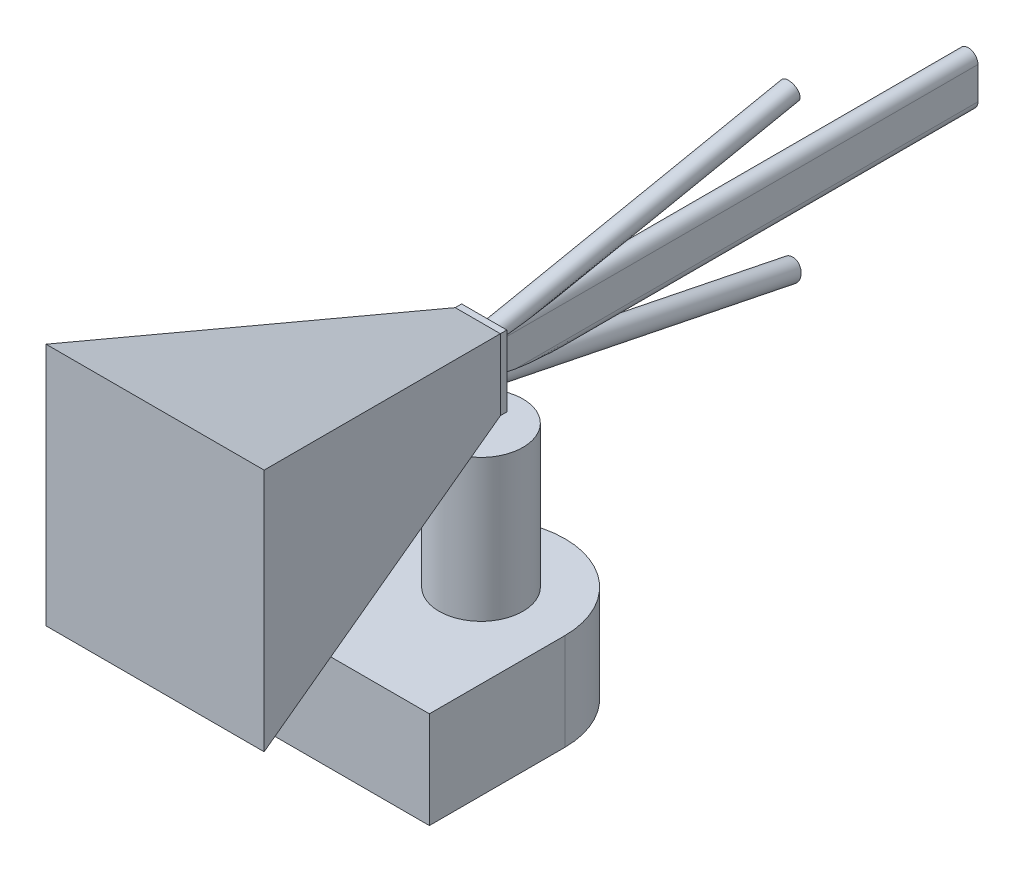
ISO-10303-21;
HEADER;
FILE_DESCRIPTION(('STEP AP214'),'2;1');
FILE_NAME('part.step','',(''),(''),'','','');
FILE_SCHEMA(('AUTOMOTIVE_DESIGN { 1 0 10303 214 1 1 1 1 }'));
ENDSEC;
DATA;
#1=APPLICATION_CONTEXT('core data for automotive mechanical design processes');
#2=APPLICATION_PROTOCOL_DEFINITION('international standard','automotive_design',2000,#1);
#3=PRODUCT_CONTEXT('',#1,'mechanical');
#4=PRODUCT('Part','Part','',(#3));
#5=PRODUCT_RELATED_PRODUCT_CATEGORY('part','',(#4));
#6=PRODUCT_DEFINITION_FORMATION('','',#4);
#7=PRODUCT_DEFINITION_CONTEXT('part definition',#1,'design');
#8=PRODUCT_DEFINITION('design','',#6,#7);
#9=PRODUCT_DEFINITION_SHAPE('','',#8);
#10=(LENGTH_UNIT() NAMED_UNIT(*) SI_UNIT(.MILLI.,.METRE.));
#11=(NAMED_UNIT(*) PLANE_ANGLE_UNIT() SI_UNIT($,.RADIAN.));
#12=(NAMED_UNIT(*) SI_UNIT($,.STERADIAN.) SOLID_ANGLE_UNIT());
#13=UNCERTAINTY_MEASURE_WITH_UNIT(LENGTH_MEASURE(1.E-05),#10,'distance_accuracy_value','');
#14=(GEOMETRIC_REPRESENTATION_CONTEXT(3) GLOBAL_UNCERTAINTY_ASSIGNED_CONTEXT((#13)) GLOBAL_UNIT_ASSIGNED_CONTEXT((#10,
#11,#12)) REPRESENTATION_CONTEXT('',''));
#15=CARTESIAN_POINT('',(0.,0.,0.));
#16=DIRECTION('',(0.,0.,1.));
#17=DIRECTION('',(1.,0.,0.));
#18=AXIS2_PLACEMENT_3D('',#15,#16,#17);
#19=CARTESIAN_POINT('',(0.,40.,0.));
#20=DIRECTION('',(0.,-1.,0.));
#21=DIRECTION('',(0.,0.,-1.));
#22=AXIS2_PLACEMENT_3D('',#19,#20,#21);
#23=CYLINDRICAL_SURFACE('',#22,1.);
#24=CARTESIAN_POINT('',(0.,37.,0.));
#25=DIRECTION('',(0.,1.,0.));
#26=DIRECTION('',(0.,0.,1.));
#27=AXIS2_PLACEMENT_3D('',#24,#25,#26);
#28=CIRCLE('',#27,1.);
#29=CARTESIAN_POINT('',(0.,37.,1.));
#30=VERTEX_POINT('',#29);
#31=EDGE_CURVE('E220',#30,#30,#28,.T.);
#32=ORIENTED_EDGE('',*,*,#31,.T.);
#33=EDGE_LOOP('',(#32));
#34=FACE_BOUND('',#33,.T.);
#35=CARTESIAN_POINT('',(0.,40.1339745962156,0.));
#36=DIRECTION('',(0.,-0.965925826289068,-0.258819045102521));
#37=DIRECTION('',(0.,-0.258819045102521,0.965925826289068));
#38=AXIS2_PLACEMENT_3D('',#35,#36,#37);
#39=ELLIPSE('',#38,1.03527618041008,1.);
#40=CARTESIAN_POINT('',(-0.866025403784437,40.,0.5));
#41=VERTEX_POINT('',#40);
#42=CARTESIAN_POINT('',(0.866025403784439,40.,0.5));
#43=VERTEX_POINT('',#42);
#44=EDGE_CURVE('E306',#41,#43,#39,.F.);
#45=ORIENTED_EDGE('',*,*,#44,.F.);
#46=CARTESIAN_POINT('',(0.,40.,0.));
#47=DIRECTION('',(0.,1.,0.));
#48=DIRECTION('',(0.,0.,1.));
#49=AXIS2_PLACEMENT_3D('',#46,#47,#48);
#50=CIRCLE('',#49,1.);
#51=CARTESIAN_POINT('',(-0.866025403784439,40.,-0.5));
#52=VERTEX_POINT('',#51);
#53=EDGE_CURVE('E214',#52,#41,#50,.T.);
#54=ORIENTED_EDGE('',*,*,#53,.F.);
#55=CARTESIAN_POINT('',(0.866025403784439,40.,-0.5));
#56=VERTEX_POINT('',#55);
#57=EDGE_CURVE('E219',#56,#52,#50,.T.);
#58=ORIENTED_EDGE('',*,*,#57,.F.);
#59=EDGE_CURVE('E215',#43,#56,#50,.T.);
#60=ORIENTED_EDGE('',*,*,#59,.F.);
#61=EDGE_LOOP('',(#45,#54,#58,#60));
#62=FACE_BOUND('',#61,.T.);
#63=ADVANCED_FACE('F43',(#34,#62),#23,.T.);
#64=CARTESIAN_POINT('',(0.,48.1244609673791,-75.5));
#65=DIRECTION('',(0.,0.,1.));
#66=DIRECTION('',(1.,0.,0.));
#67=AXIS2_PLACEMENT_3D('',#64,#65,#66);
#68=CYLINDRICAL_SURFACE('',#67,1.5);
#69=CARTESIAN_POINT('',(0.,48.1244609673791,-0.69537024483542));
#70=DIRECTION('',(0.,-0.10018806161207,0.994968518250912));
#71=DIRECTION('',(0.,0.994968518250913,0.100188061612069));
#72=AXIS2_PLACEMENT_3D('',#69,#70,#71);
#73=ELLIPSE('',#72,1.50758538836676,1.5);
#74=CARTESIAN_POINT('',(-1.5,48.1244609673791,-0.69537024483542));
#75=VERTEX_POINT('',#74);
#76=CARTESIAN_POINT('',(1.5,48.1244609673791,-0.695370244835212));
#77=VERTEX_POINT('',#76);
#78=EDGE_CURVE('E11',#75,#77,#73,.F.);
#79=ORIENTED_EDGE('',*,*,#78,.F.);
#80=DIRECTION('',(0.,0.,1.));
#81=VECTOR('',#80,1.);
#82=CARTESIAN_POINT('',(-1.5,48.1244609673791,-75.5));
#83=LINE('',#82,#81);
#84=CARTESIAN_POINT('',(-1.5,48.1244609673791,-0.5));
#85=VERTEX_POINT('',#84);
#86=EDGE_CURVE('E269',#75,#85,#83,.T.);
#87=ORIENTED_EDGE('',*,*,#86,.T.);
#88=CARTESIAN_POINT('',(0.,48.1244609673791,-0.5));
#89=DIRECTION('',(0.,0.,-1.));
#90=DIRECTION('',(-1.,0.,0.));
#91=AXIS2_PLACEMENT_3D('',#88,#89,#90);
#92=CIRCLE('',#91,1.5);
#93=CARTESIAN_POINT('',(1.5,48.1244609673791,-0.5));
#94=VERTEX_POINT('',#93);
#95=EDGE_CURVE('E273',#85,#94,#92,.T.);
#96=ORIENTED_EDGE('',*,*,#95,.T.);
#97=DIRECTION('',(0.,0.,1.));
#98=VECTOR('',#97,1.);
#99=CARTESIAN_POINT('',(1.5,48.1244609673791,-75.5));
#100=LINE('',#99,#98);
#101=EDGE_CURVE('E271',#77,#94,#100,.T.);
#102=ORIENTED_EDGE('',*,*,#101,.F.);
#103=EDGE_LOOP('',(#79,#87,#96,#102));
#104=FACE_BOUND('',#103,.T.);
#105=ADVANCED_FACE('F266',(#104),#68,.T.);
#106=CARTESIAN_POINT('',(0.,48.1244609673791,-0.69537024483542));
#107=DIRECTION('',(0.,0.994968518250913,0.100188061612069));
#108=DIRECTION('',(0.,-0.10018806161207,0.994968518250912));
#109=AXIS2_PLACEMENT_3D('',#106,#107,#108);
#110=ELLIPSE('',#109,14.9718437093637,1.5);
#111=EDGE_CURVE('E51',#77,#75,#110,.T.);
#112=ORIENTED_EDGE('',*,*,#111,.F.);
#113=CARTESIAN_POINT('',(1.5,48.1244609673791,-75.5));
#114=VERTEX_POINT('',#113);
#115=EDGE_CURVE('E274',#114,#77,#100,.T.);
#116=ORIENTED_EDGE('',*,*,#115,.F.);
#117=CARTESIAN_POINT('',(0.,48.1244609673791,-75.5));
#118=DIRECTION('',(0.,0.,-1.));
#119=DIRECTION('',(-1.,0.,0.));
#120=AXIS2_PLACEMENT_3D('',#117,#118,#119);
#121=CIRCLE('',#120,1.5);
#122=CARTESIAN_POINT('',(-1.5,48.1244609673791,-75.5));
#123=VERTEX_POINT('',#122);
#124=EDGE_CURVE('E656',#123,#114,#121,.T.);
#125=ORIENTED_EDGE('',*,*,#124,.F.);
#126=EDGE_CURVE('E666',#123,#75,#83,.T.);
#127=ORIENTED_EDGE('',*,*,#126,.T.);
#128=EDGE_LOOP('',(#112,#116,#125,#127));
#129=FACE_BOUND('',#128,.T.);
#130=ADVANCED_FACE('F389',(#129),#68,.T.);
#131=CARTESIAN_POINT('',(1.5,48.1244609673791,-75.5));
#132=DIRECTION('',(-1.,0.,0.));
#133=DIRECTION('',(0.,-1.,0.));
#134=AXIS2_PLACEMENT_3D('',#131,#132,#133);
#135=PLANE('',#134);
#136=DIRECTION('',(0.,-1.,0.));
#137=VECTOR('',#136,1.);
#138=CARTESIAN_POINT('',(1.5,48.1244609673791,-0.5));
#139=LINE('',#138,#137);
#140=CARTESIAN_POINT('',(1.5,43.7827208852217,-0.500000000000004));
#141=VERTEX_POINT('',#140);
#142=EDGE_CURVE('E65',#94,#141,#139,.T.);
#143=ORIENTED_EDGE('',*,*,#142,.T.);
#144=DIRECTION('',(0.,0.199367934417198,0.979924704620829));
#145=VECTOR('',#144,1.);
#146=CARTESIAN_POINT('',(1.5,34.1011934948138,-48.0862274244718));
#147=LINE('',#146,#145);
#148=CARTESIAN_POINT('',(1.5,43.1244609673791,-3.73545086345607));
#149=VERTEX_POINT('',#148);
#150=EDGE_CURVE('E352',#149,#141,#147,.T.);
#151=ORIENTED_EDGE('',*,*,#150,.F.);
#152=DIRECTION('',(0.,0.,1.));
#153=VECTOR('',#152,1.);
#154=CARTESIAN_POINT('',(1.5,43.1244609673791,-75.5));
#155=LINE('',#154,#153);
#156=CARTESIAN_POINT('',(1.5,43.1244609673791,-75.5));
#157=VERTEX_POINT('',#156);
#158=EDGE_CURVE('E275',#157,#149,#155,.T.);
#159=ORIENTED_EDGE('',*,*,#158,.F.);
#160=DIRECTION('',(0.,-1.,0.));
#161=VECTOR('',#160,1.);
#162=CARTESIAN_POINT('',(1.5,48.1244609673791,-75.5));
#163=LINE('',#162,#161);
#164=EDGE_CURVE('E279',#114,#157,#163,.T.);
#165=ORIENTED_EDGE('',*,*,#164,.F.);
#166=ORIENTED_EDGE('',*,*,#115,.T.);
#167=ORIENTED_EDGE('',*,*,#101,.T.);
#168=EDGE_LOOP('',(#143,#151,#159,#165,#166,#167));
#169=FACE_BOUND('',#168,.T.);
#170=ADVANCED_FACE('F277',(#169),#135,.F.);
#171=CARTESIAN_POINT('',(0.,43.1244609673791,-75.5));
#172=DIRECTION('',(0.,0.,1.));
#173=DIRECTION('',(1.,0.,0.));
#174=AXIS2_PLACEMENT_3D('',#171,#172,#173);
#175=CYLINDRICAL_SURFACE('',#174,1.5);
#176=CARTESIAN_POINT('',(-1.5,43.1244609673791,-3.73545086345608));
#177=CARTESIAN_POINT('',(-1.49996813347641,43.0995779038182,-3.85815829877453));
#178=CARTESIAN_POINT('',(-1.49938080980765,43.0762771419897,-3.98116619984791));
#179=CARTESIAN_POINT('',(-1.49732415445959,43.0320768414088,-4.22758739734753));
#180=CARTESIAN_POINT('',(-1.49585496709297,43.0111769104388,-4.35100062415855));
#181=CARTESIAN_POINT('',(-1.49226388024787,42.9710133997347,-4.59803938408783));
#182=CARTESIAN_POINT('',(-1.49014218071588,42.951749321038,-4.72166484064963));
#183=CARTESIAN_POINT('',(-1.48534322783844,42.9144369561793,-4.96909369621417));
#184=CARTESIAN_POINT('',(-1.48266594818866,42.8963887276362,-5.0928971033664));
#185=CARTESIAN_POINT('',(-1.47389535203001,42.8435427142404,-5.46484176293595));
#186=CARTESIAN_POINT('',(-1.46706894454774,42.8101000784659,-5.71315753603416));
#187=CARTESIAN_POINT('',(-1.4516900378375,42.7453912531097,-6.2100340411245));
#188=CARTESIAN_POINT('',(-1.44313739964608,42.7141252390211,-6.45859479123347));
#189=CARTESIAN_POINT('',(-1.42435826232236,42.65305488057,-6.95563999118357));
#190=CARTESIAN_POINT('',(-1.4141330421722,42.6232494417982,-7.2041243551029));
#191=CARTESIAN_POINT('',(-1.39196671490749,42.5646333057704,-7.70113424400193));
#192=CARTESIAN_POINT('',(-1.38002559850093,42.5358226139021,-7.94965976919727));
#193=CARTESIAN_POINT('',(-1.34149854790142,42.4504436146349,-8.69527034145969));
#194=CARTESIAN_POINT('',(-1.31221074688194,42.3949343141408,-9.19234003757811));
#195=CARTESIAN_POINT('',(-1.24518660106658,42.2856385603269,-10.1850616055361));
#196=CARTESIAN_POINT('',(-1.20746797668559,42.2318487600317,-10.6807142743524));
#197=CARTESIAN_POINT('',(-1.14256369398684,42.1519843486193,-11.4234462169521));
#198=CARTESIAN_POINT('',(-1.11954694996766,42.1255051003692,-11.6708468345105));
#199=CARTESIAN_POINT('',(-1.07017711602206,42.0727807086154,-12.1653372153744));
#200=CARTESIAN_POINT('',(-1.0438241168874,42.0465355587619,-12.4124269869545));
#201=CARTESIAN_POINT('',(-0.987025822684605,41.9942993012283,-12.90575291568));
#202=CARTESIAN_POINT('',(-0.956587269253748,41.9683078491426,-13.1519898077378));
#203=CARTESIAN_POINT('',(-0.890297376207145,41.9165038622994,-13.6440467187636));
#204=CARTESIAN_POINT('',(-0.854440237979181,41.890691550575,-13.8898660023716));
#205=CARTESIAN_POINT('',(-0.794669163499346,41.8520372009708,-14.2587905923196));
#206=CARTESIAN_POINT('',(-0.773639867311145,41.8391052192713,-14.3823529907962));
#207=CARTESIAN_POINT('',(-0.729076903321482,41.8133109261575,-14.6290629948636));
#208=CARTESIAN_POINT('',(-0.705542766021177,41.800448628281,-14.7522105182131));
#209=CARTESIAN_POINT('',(-0.655238102383886,41.7748474095169,-14.9975534237133));
#210=CARTESIAN_POINT('',(-0.62847536160107,41.762108268787,-15.1197503688708));
#211=CARTESIAN_POINT('',(-0.570373076316197,41.7367659561074,-15.363048384276));
#212=CARTESIAN_POINT('',(-0.539035552535199,41.7241627267504,-15.4841499134264));
#213=CARTESIAN_POINT('',(-0.486334850986281,41.7053680675778,-15.6648847613913));
#214=CARTESIAN_POINT('',(-0.467703976026362,41.6990883472788,-15.7252965615944));
#215=CARTESIAN_POINT('',(-0.427787014452388,41.6866018640821,-15.8454636082689));
#216=CARTESIAN_POINT('',(-0.40649271630824,41.680395394752,-15.9052161738758));
#217=CARTESIAN_POINT('',(-0.360444493509659,41.6682149935425,-16.0225245856233));
#218=CARTESIAN_POINT('',(-0.335741728366959,41.6622390444318,-16.0800992792556));
#219=CARTESIAN_POINT('',(-0.294164450244206,41.6535221089461,-16.164109027076));
#220=CARTESIAN_POINT('',(-0.279589592799112,41.6506638255654,-16.1916604609768));
#221=CARTESIAN_POINT('',(-0.248338322730478,41.6450747245471,-16.2455429808797));
#222=CARTESIAN_POINT('',(-0.231665428845187,41.6423437037418,-16.2718760114841));
#223=CARTESIAN_POINT('',(-0.200821903371236,41.6379105714778,-16.3146271138849));
#224=CARTESIAN_POINT('',(-0.187450804548295,41.6361496731762,-16.3316101855342));
#225=CARTESIAN_POINT('',(-0.15871240794768,41.6328106809617,-16.3638161066274));
#226=CARTESIAN_POINT('',(-0.143351714724832,41.6312320135353,-16.3790444781412));
#227=CARTESIAN_POINT('',(-0.117730409664257,41.6290617258718,-16.3999812953831));
#228=CARTESIAN_POINT('',(-0.108417859063228,41.6283523835421,-16.4068246446752));
#229=CARTESIAN_POINT('',(-0.0889411548890778,41.6270683535481,-16.4192126597424));
#230=CARTESIAN_POINT('',(-0.0787776257220318,41.6264935683077,-16.4247582665929));
#231=CARTESIAN_POINT('',(-0.0594982972339561,41.625616170216,-16.4332237082527));
#232=CARTESIAN_POINT('',(-0.0505137818544598,41.6252834359557,-16.4364341260121));
#233=CARTESIAN_POINT('',(-0.032134636019435,41.6247771748626,-16.4413188809311));
#234=CARTESIAN_POINT('',(-0.022740693618993,41.6246033909547,-16.4429956984275));
#235=CARTESIAN_POINT('',(-0.00374669743843599,41.6244354762711,-16.4446158839881));
#236=CARTESIAN_POINT('',(0.00585419117805461,41.6244423133661,-16.444549913194));
#237=CARTESIAN_POINT('',(0.0248832391580832,41.6246370903653,-16.4426705381119));
#238=CARTESIAN_POINT('',(0.0343112303532574,41.6248251979538,-16.4408555158621));
#239=CARTESIAN_POINT('',(0.0544359285996451,41.6254092035235,-16.4352206416716));
#240=CARTESIAN_POINT('',(0.0650432178078828,41.62583719514,-16.4310911432372));
#241=CARTESIAN_POINT('',(0.0854551196355099,41.6268620755894,-16.4212028585482));
#242=CARTESIAN_POINT('',(0.0952580240750451,41.6274593124402,-16.4154407150999));
#243=CARTESIAN_POINT('',(0.120721177313436,41.6292395932155,-16.3982652497853));
#244=CARTESIAN_POINT('',(0.135611728450535,41.6305379227278,-16.3857401412385));
#245=CARTESIAN_POINT('',(0.163504533921249,41.6333330141144,-16.3587778713503));
#246=CARTESIAN_POINT('',(0.176500658148078,41.6348303914517,-16.3443347796821));
#247=CARTESIAN_POINT('',(0.207831286376725,41.6388037961402,-16.3060123925372));
#248=CARTESIAN_POINT('',(0.225153262804951,41.6413638306779,-16.2813247051291));
#249=CARTESIAN_POINT('',(0.257493018205711,41.6466372080415,-16.2304786472246));
#250=CARTESIAN_POINT('',(0.272505037511003,41.6493509117193,-16.2043168158629));
#251=CARTESIAN_POINT('',(0.30093330732306,41.6548862403187,-16.1509612043651));
#252=CARTESIAN_POINT('',(0.314339760281176,41.6577084014949,-16.1237623037603));
#253=CARTESIAN_POINT('',(0.339853168284481,41.6634103267215,-16.0688184450429));
#254=CARTESIAN_POINT('',(0.351961729578045,41.6662900142146,-16.04107421337));
#255=CARTESIAN_POINT('',(0.390105276129972,41.6758153754974,-15.9493181947122));
#256=CARTESIAN_POINT('',(0.41406933473938,41.6825511592746,-15.8844583780839));
#257=CARTESIAN_POINT('',(0.45874020389324,41.6961436954648,-15.7536282937536));
#258=CARTESIAN_POINT('',(0.47944459439416,41.7030005335901,-15.6876572408957));
#259=CARTESIAN_POINT('',(0.538204792080838,41.723714812338,-15.4884479142841));
#260=CARTESIAN_POINT('',(0.572798786206645,41.7376856244247,-15.3542062810936));
#261=CARTESIAN_POINT('',(0.636532568632085,41.7657823097585,-15.0844930375912));
#262=CARTESIAN_POINT('',(0.665671523279084,41.7799082063574,-14.9490212425945));
#263=CARTESIAN_POINT('',(0.720085750573055,41.8082475276501,-14.6775245068229));
#264=CARTESIAN_POINT('',(0.745366622780565,41.8224607937363,-14.5415006676134));
#265=CARTESIAN_POINT('',(0.792891432909289,41.8508520359871,-14.2701039577802));
#266=CARTESIAN_POINT('',(0.815158848093151,41.8650293249622,-14.1347350623597));
#267=CARTESIAN_POINT('',(0.857480226108897,41.8934551921374,-13.8636573779739));
#268=CARTESIAN_POINT('',(0.877534123384187,41.9077037724358,-13.7279485790634));
#269=CARTESIAN_POINT('',(0.935004855568699,41.9505515243893,-13.3204127339356));
#270=CARTESIAN_POINT('',(0.969724042247014,41.9792485468616,-13.0482160282769));
#271=CARTESIAN_POINT('',(1.03398473206572,42.0369281899395,-12.5029515889396));
#272=CARTESIAN_POINT('',(1.06352051770932,42.0659110891338,-12.2298832275264));
#273=CARTESIAN_POINT('',(1.11847876476061,42.1241570048732,-11.6833885880172));
#274=CARTESIAN_POINT('',(1.14390156629396,42.1534199980435,-11.4099623414036));
#275=CARTESIAN_POINT('',(1.19133126591036,42.2122367842641,-10.8632578523162));
#276=CARTESIAN_POINT('',(1.21334313509857,42.2417900860782,-10.589979984039));
#277=CARTESIAN_POINT('',(1.25448523695597,42.3013114808092,-10.0432481211158));
#278=CARTESIAN_POINT('',(1.27361541019221,42.3312795822671,-9.76979412295402));
#279=CARTESIAN_POINT('',(1.30933106288302,42.3917368779562,-9.22289758345391));
#280=CARTESIAN_POINT('',(1.32591763109455,42.4222258429925,-8.94945508758069));
#281=CARTESIAN_POINT('',(1.35679785808162,42.4839237341289,-8.4025217123588));
#282=CARTESIAN_POINT('',(1.37109150857591,42.5151326628287,-8.12903083283897));
#283=CARTESIAN_POINT('',(1.40097692088194,42.5867411627906,-7.51131382139093));
#284=CARTESIAN_POINT('',(1.41594801472522,42.6274298145902,-7.16709061729991));
#285=CARTESIAN_POINT('',(1.43599112242807,42.6903979605514,-6.65090071269326));
#286=CARTESIAN_POINT('',(1.44226988941636,42.7117098117108,-6.47886201581685));
#287=CARTESIAN_POINT('',(1.45401385998491,42.7552016050563,-6.13486140679742));
#288=CARTESIAN_POINT('',(1.45947904227186,42.7773815699436,-5.96289949678148));
#289=CARTESIAN_POINT('',(1.46956327583998,42.822917902549,-5.61912600829226));
#290=CARTESIAN_POINT('',(1.47418242591518,42.846274132504,-5.44731441460092));
#291=CARTESIAN_POINT('',(1.48249516281054,42.8946540658489,-5.10391469035938));
#292=CARTESIAN_POINT('',(1.48618881474005,42.9196776517825,-4.93232654493479));
#293=CARTESIAN_POINT('',(1.49248726157182,42.9721884954903,-4.5894545117956));
#294=CARTESIAN_POINT('',(1.49509177895633,42.9996763790178,-4.41817071268741));
#295=CARTESIAN_POINT('',(1.49790287601738,43.0438153599104,-4.16170912496064));
#296=CARTESIAN_POINT('',(1.49865731936358,43.0590148295103,-4.07628930599409));
#297=CARTESIAN_POINT('',(1.49970179541679,43.0906971371042,-3.90567812295287));
#298=CARTESIAN_POINT('',(1.49999178637487,43.1071800903289,-3.82048678010263));
#299=CARTESIAN_POINT('',(1.5,43.1244609673791,-3.73545086345608));
#300=B_SPLINE_CURVE_WITH_KNOTS('',3,(#176,#177,#178,#179,#180,#181,#182,#183,#184,#185,#186,
#187,#188,#189,#190,#191,#192,#193,#194,#195,#196,#197,#198,#199,#200,#201,#202,#203,#204,#205,
#206,#207,#208,#209,#210,#211,#212,#213,#214,#215,#216,#217,#218,#219,#220,#221,#222,#223,#224,
#225,#226,#227,#228,#229,#230,#231,#232,#233,#234,#235,#236,#237,#238,#239,#240,#241,#242,#243,
#244,#245,#246,#247,#248,#249,#250,#251,#252,#253,#254,#255,#256,#257,#258,#259,#260,#261,#262,
#263,#264,#265,#266,#267,#268,#269,#270,#271,#272,#273,#274,#275,#276,#277,#278,#279,#280,#281,
#282,#283,#284,#285,#286,#287,#288,#289,#290,#291,#292,#293,#294,#295,#296,#297,#298,#299),
.UNSPECIFIED.,.F.,.F.,(4,2,2,2,2,2,2,2,2,2,2,2,2,2,2,2,2,2,2,2,2,2,2,2,2,2,2,2,2,2,2,2,2,2,2,2,
2,2,2,2,2,2,2,2,2,2,2,2,2,2,2,2,2,2,2,2,2,2,2,2,2,4),(0.,0.37557501096278,0.751088577658592,
1.12648719179944,1.50190358349717,2.25382930199699,3.00581557549745,3.75722948894058,
4.50864747162225,6.01163263052639,7.51148794437149,8.2610989453566,9.01068955105512,
9.75905811279512,10.5082332760098,10.8862288876851,11.2642954747525,11.6414679498841,
12.0184743259638,12.2090215572868,12.400171451166,12.5887136626135,12.6825605747946,
12.7762521378782,12.8412249670731,12.9059873933027,12.9406477524451,12.9752828987327,
13.0038105161328,13.0322919129667,13.0609259602493,13.0895865209379,13.1235680499065,
13.1576199683305,13.215792753677,13.2741497874992,13.364715642539,13.4555037784729,
13.5468203875617,13.6380226472176,13.8462733523141,14.0546779451906,14.4724263428229,
14.8902385297769,15.3074384222582,15.721173593718,16.1349210152685,16.9625374977158,
17.7910612132931,18.6195163785529,19.4467525584476,20.2740057971758,21.1009039466183,
21.9278050824723,22.9686088532064,23.489007988372,24.0094207411372,24.5297726847519,
25.0500880110064,25.5705358359318,25.8308207106229,26.0911289806153),.UNSPECIFIED.);
#301=CARTESIAN_POINT('',(-1.5,43.1244609673791,-3.73545086345609));
#302=VERTEX_POINT('',#301);
#303=EDGE_CURVE('E343',#302,#149,#300,.T.);
#304=ORIENTED_EDGE('',*,*,#303,.F.);
#305=DIRECTION('',(0.,0.,1.));
#306=VECTOR('',#305,1.);
#307=CARTESIAN_POINT('',(-1.5,43.1244609673791,-75.5));
#308=LINE('',#307,#306);
#309=CARTESIAN_POINT('',(-1.5,43.1244609673791,-75.5));
#310=VERTEX_POINT('',#309);
#311=EDGE_CURVE('E667',#310,#302,#308,.T.);
#312=ORIENTED_EDGE('',*,*,#311,.F.);
#313=CARTESIAN_POINT('',(0.,43.1244609673791,-75.5));
#314=DIRECTION('',(0.,0.,-1.));
#315=DIRECTION('',(-1.,0.,0.));
#316=AXIS2_PLACEMENT_3D('',#313,#314,#315);
#317=CIRCLE('',#316,1.5);
#318=EDGE_CURVE('E660',#157,#310,#317,.T.);
#319=ORIENTED_EDGE('',*,*,#318,.F.);
#320=ORIENTED_EDGE('',*,*,#158,.T.);
#321=EDGE_LOOP('',(#304,#312,#319,#320));
#322=FACE_BOUND('',#321,.T.);
#323=ADVANCED_FACE('F354',(#322),#175,.T.);
#324=CARTESIAN_POINT('',(-1.5,48.1244609673791,-75.5));
#325=DIRECTION('',(1.,0.,0.));
#326=DIRECTION('',(0.,1.,0.));
#327=AXIS2_PLACEMENT_3D('',#324,#325,#326);
#328=PLANE('',#327);
#329=DIRECTION('',(0.,1.,0.));
#330=VECTOR('',#329,1.);
#331=CARTESIAN_POINT('',(-1.5,48.1244609673791,-0.5));
#332=LINE('',#331,#330);
#333=CARTESIAN_POINT('',(-1.5,43.7827208852217,-0.500000000000004));
#334=VERTEX_POINT('',#333);
#335=EDGE_CURVE('E658',#334,#85,#332,.T.);
#336=ORIENTED_EDGE('',*,*,#335,.T.);
#337=ORIENTED_EDGE('',*,*,#86,.F.);
#338=ORIENTED_EDGE('',*,*,#126,.F.);
#339=DIRECTION('',(0.,1.,0.));
#340=VECTOR('',#339,1.);
#341=CARTESIAN_POINT('',(-1.5,48.1244609673791,-75.5));
#342=LINE('',#341,#340);
#343=EDGE_CURVE('E662',#310,#123,#342,.T.);
#344=ORIENTED_EDGE('',*,*,#343,.F.);
#345=ORIENTED_EDGE('',*,*,#311,.T.);
#346=DIRECTION('',(0.,0.199367934417198,0.979924704620829));
#347=VECTOR('',#346,1.);
#348=CARTESIAN_POINT('',(-1.5,34.1011934948138,-48.0862274244718));
#349=LINE('',#348,#347);
#350=EDGE_CURVE('E259',#334,#302,#349,.F.);
#351=ORIENTED_EDGE('',*,*,#350,.F.);
#352=EDGE_LOOP('',(#336,#337,#338,#344,#345,#351));
#353=FACE_BOUND('',#352,.T.);
#354=ADVANCED_FACE('F370',(#353),#328,.F.);
#355=CARTESIAN_POINT('',(-3.5,51.,-0.5));
#356=DIRECTION('',(0.,0.,1.));
#357=DIRECTION('',(1.,0.,0.));
#358=AXIS2_PLACEMENT_3D('',#355,#356,#357);
#359=PLANE('',#358);
#360=CARTESIAN_POINT('',(0.,43.2464203293871,-0.5));
#361=DIRECTION('',(0.,0.,1.));
#362=DIRECTION('',(0.,1.,0.));
#363=AXIS2_PLACEMENT_3D('',#360,#361,#362);
#364=ELLIPSE('',#363,1.62195936200796,1.58939804872264);
#365=EDGE_CURVE('E650',#141,#334,#364,.F.);
#366=ORIENTED_EDGE('',*,*,#365,.F.);
#367=ORIENTED_EDGE('',*,*,#142,.F.);
#368=ORIENTED_EDGE('',*,*,#95,.F.);
#369=ORIENTED_EDGE('',*,*,#335,.F.);
#370=EDGE_LOOP('',(#366,#367,#368,#369));
#371=FACE_BOUND('',#370,.T.);
#372=DIRECTION('',(-1.,0.,0.));
#373=VECTOR('',#372,1.);
#374=CARTESIAN_POINT('',(-3.5,40.,-0.5));
#375=LINE('',#374,#373);
#376=CARTESIAN_POINT('',(3.5,40.,-0.5));
#377=VERTEX_POINT('',#376);
#378=EDGE_CURVE('E293',#377,#56,#375,.T.);
#379=ORIENTED_EDGE('',*,*,#378,.T.);
#380=EDGE_CURVE('E223',#56,#52,#375,.T.);
#381=ORIENTED_EDGE('',*,*,#380,.T.);
#382=CARTESIAN_POINT('',(-3.5,40.,-0.5));
#383=VERTEX_POINT('',#382);
#384=EDGE_CURVE('E284',#52,#383,#375,.T.);
#385=ORIENTED_EDGE('',*,*,#384,.T.);
#386=DIRECTION('',(0.,-1.,0.));
#387=VECTOR('',#386,1.);
#388=CARTESIAN_POINT('',(-3.5,51.,-0.5));
#389=LINE('',#388,#387);
#390=CARTESIAN_POINT('',(-3.5,51.,-0.5));
#391=VERTEX_POINT('',#390);
#392=EDGE_CURVE('E204',#391,#383,#389,.T.);
#393=ORIENTED_EDGE('',*,*,#392,.F.);
#394=DIRECTION('',(-1.,0.,0.));
#395=VECTOR('',#394,1.);
#396=CARTESIAN_POINT('',(-3.5,51.,-0.5));
#397=LINE('',#396,#395);
#398=CARTESIAN_POINT('',(3.5,51.,-0.5));
#399=VERTEX_POINT('',#398);
#400=EDGE_CURVE('E194',#399,#391,#397,.T.);
#401=ORIENTED_EDGE('',*,*,#400,.F.);
#402=DIRECTION('',(0.,-1.,0.));
#403=VECTOR('',#402,1.);
#404=CARTESIAN_POINT('',(3.5,51.,-0.5));
#405=LINE('',#404,#403);
#406=EDGE_CURVE('E206',#399,#377,#405,.T.);
#407=ORIENTED_EDGE('',*,*,#406,.T.);
#408=EDGE_LOOP('',(#379,#381,#385,#393,#401,#407));
#409=FACE_BOUND('',#408,.T.);
#410=ADVANCED_FACE('F322',(#371,#409),#359,.F.);
#411=CARTESIAN_POINT('',(0.,15.,0.));
#412=DIRECTION('',(0.,-1.,0.));
#413=DIRECTION('',(0.,0.,-1.));
#414=AXIS2_PLACEMENT_3D('',#411,#412,#413);
#415=CYLINDRICAL_SURFACE('',#414,13.);
#416=CARTESIAN_POINT('',(0.,0.,0.));
#417=DIRECTION('',(0.,1.,0.));
#418=DIRECTION('',(0.,0.,1.));
#419=AXIS2_PLACEMENT_3D('',#416,#417,#418);
#420=CIRCLE('',#419,13.);
#421=CARTESIAN_POINT('',(13.,0.,0.));
#422=VERTEX_POINT('',#421);
#423=CARTESIAN_POINT('',(-13.,0.,0.));
#424=VERTEX_POINT('',#423);
#425=EDGE_CURVE('E227',#422,#424,#420,.T.);
#426=ORIENTED_EDGE('',*,*,#425,.T.);
#427=DIRECTION('',(0.,-1.,0.));
#428=VECTOR('',#427,1.);
#429=CARTESIAN_POINT('',(-13.,15.,0.));
#430=LINE('',#429,#428);
#431=CARTESIAN_POINT('',(-13.,15.,0.));
#432=VERTEX_POINT('',#431);
#433=EDGE_CURVE('E230',#432,#424,#430,.T.);
#434=ORIENTED_EDGE('',*,*,#433,.F.);
#435=CARTESIAN_POINT('',(0.,15.,0.));
#436=DIRECTION('',(0.,1.,0.));
#437=DIRECTION('',(0.,0.,1.));
#438=AXIS2_PLACEMENT_3D('',#435,#436,#437);
#439=CIRCLE('',#438,13.);
#440=CARTESIAN_POINT('',(13.,15.,0.));
#441=VERTEX_POINT('',#440);
#442=EDGE_CURVE('E231',#441,#432,#439,.T.);
#443=ORIENTED_EDGE('',*,*,#442,.F.);
#444=DIRECTION('',(0.,-1.,0.));
#445=VECTOR('',#444,1.);
#446=CARTESIAN_POINT('',(13.,15.,0.));
#447=LINE('',#446,#445);
#448=EDGE_CURVE('E241',#441,#422,#447,.T.);
#449=ORIENTED_EDGE('',*,*,#448,.T.);
#450=EDGE_LOOP('',(#426,#434,#443,#449));
#451=FACE_BOUND('',#450,.T.);
#452=ADVANCED_FACE('F45',(#451),#415,.T.);
#453=CARTESIAN_POINT('',(-13.,15.,0.));
#454=DIRECTION('',(1.,0.,0.));
#455=DIRECTION('',(0.,0.,-1.));
#456=AXIS2_PLACEMENT_3D('',#453,#454,#455);
#457=PLANE('',#456);
#458=DIRECTION('',(0.,0.,1.));
#459=VECTOR('',#458,1.);
#460=CARTESIAN_POINT('',(-13.,0.,0.));
#461=LINE('',#460,#459);
#462=CARTESIAN_POINT('',(-13.,0.,21.));
#463=VERTEX_POINT('',#462);
#464=EDGE_CURVE('E244',#424,#463,#461,.T.);
#465=ORIENTED_EDGE('',*,*,#464,.T.);
#466=DIRECTION('',(0.,-1.,0.));
#467=VECTOR('',#466,1.);
#468=CARTESIAN_POINT('',(-13.,15.,21.));
#469=LINE('',#468,#467);
#470=CARTESIAN_POINT('',(-13.,15.,21.));
#471=VERTEX_POINT('',#470);
#472=EDGE_CURVE('E254',#471,#463,#469,.T.);
#473=ORIENTED_EDGE('',*,*,#472,.F.);
#474=DIRECTION('',(0.,0.,1.));
#475=VECTOR('',#474,1.);
#476=CARTESIAN_POINT('',(-13.,15.,0.));
#477=LINE('',#476,#475);
#478=EDGE_CURVE('E234',#432,#471,#477,.T.);
#479=ORIENTED_EDGE('',*,*,#478,.F.);
#480=ORIENTED_EDGE('',*,*,#433,.T.);
#481=EDGE_LOOP('',(#465,#473,#479,#480));
#482=FACE_BOUND('',#481,.T.);
#483=ADVANCED_FACE('F416',(#482),#457,.F.);
#484=CARTESIAN_POINT('',(-13.,15.,21.));
#485=DIRECTION('',(0.,0.,-1.));
#486=DIRECTION('',(-1.,0.,0.));
#487=AXIS2_PLACEMENT_3D('',#484,#485,#486);
#488=PLANE('',#487);
#489=DIRECTION('',(1.,0.,0.));
#490=VECTOR('',#489,1.);
#491=CARTESIAN_POINT('',(-13.,0.,21.));
#492=LINE('',#491,#490);
#493=CARTESIAN_POINT('',(13.,0.,21.));
#494=VERTEX_POINT('',#493);
#495=EDGE_CURVE('E246',#463,#494,#492,.T.);
#496=ORIENTED_EDGE('',*,*,#495,.T.);
#497=DIRECTION('',(0.,-1.,0.));
#498=VECTOR('',#497,1.);
#499=CARTESIAN_POINT('',(13.,15.,21.));
#500=LINE('',#499,#498);
#501=CARTESIAN_POINT('',(13.,15.,21.));
#502=VERTEX_POINT('',#501);
#503=EDGE_CURVE('E251',#502,#494,#500,.T.);
#504=ORIENTED_EDGE('',*,*,#503,.F.);
#505=DIRECTION('',(1.,0.,0.));
#506=VECTOR('',#505,1.);
#507=CARTESIAN_POINT('',(-13.,15.,21.));
#508=LINE('',#507,#506);
#509=EDGE_CURVE('E237',#471,#502,#508,.T.);
#510=ORIENTED_EDGE('',*,*,#509,.F.);
#511=ORIENTED_EDGE('',*,*,#472,.T.);
#512=EDGE_LOOP('',(#496,#504,#510,#511));
#513=FACE_BOUND('',#512,.T.);
#514=ADVANCED_FACE('F413',(#513),#488,.F.);
#515=CARTESIAN_POINT('',(13.,15.,21.));
#516=DIRECTION('',(-1.,0.,0.));
#517=DIRECTION('',(0.,0.,1.));
#518=AXIS2_PLACEMENT_3D('',#515,#516,#517);
#519=PLANE('',#518);
#520=DIRECTION('',(0.,0.,-1.));
#521=VECTOR('',#520,1.);
#522=CARTESIAN_POINT('',(13.,0.,21.));
#523=LINE('',#522,#521);
#524=EDGE_CURVE('E235',#494,#422,#523,.T.);
#525=ORIENTED_EDGE('',*,*,#524,.T.);
#526=ORIENTED_EDGE('',*,*,#448,.F.);
#527=DIRECTION('',(0.,0.,-1.));
#528=VECTOR('',#527,1.);
#529=CARTESIAN_POINT('',(13.,15.,21.));
#530=LINE('',#529,#528);
#531=EDGE_CURVE('E239',#502,#441,#530,.T.);
#532=ORIENTED_EDGE('',*,*,#531,.F.);
#533=ORIENTED_EDGE('',*,*,#503,.T.);
#534=EDGE_LOOP('',(#525,#526,#532,#533));
#535=FACE_BOUND('',#534,.T.);
#536=ADVANCED_FACE('F406',(#535),#519,.F.);
#537=CARTESIAN_POINT('',(0.,15.,0.));
#538=DIRECTION('',(0.,1.,0.));
#539=DIRECTION('',(0.,0.,1.));
#540=AXIS2_PLACEMENT_3D('',#537,#538,#539);
#541=PLANE('',#540);
#542=CARTESIAN_POINT('',(0.,15.,0.));
#543=DIRECTION('',(0.,1.,0.));
#544=DIRECTION('',(0.,0.,1.));
#545=AXIS2_PLACEMENT_3D('',#542,#543,#544);
#546=CIRCLE('',#545,6.5);
#547=CARTESIAN_POINT('',(0.,15.,6.5));
#548=VERTEX_POINT('',#547);
#549=EDGE_CURVE('E224',#548,#548,#546,.T.);
#550=ORIENTED_EDGE('',*,*,#549,.F.);
#551=EDGE_LOOP('',(#550));
#552=FACE_BOUND('',#551,.T.);
#553=ORIENTED_EDGE('',*,*,#442,.T.);
#554=ORIENTED_EDGE('',*,*,#478,.T.);
#555=ORIENTED_EDGE('',*,*,#509,.T.);
#556=ORIENTED_EDGE('',*,*,#531,.T.);
#557=EDGE_LOOP('',(#553,#554,#555,#556));
#558=FACE_BOUND('',#557,.T.);
#559=ADVANCED_FACE('F403',(#552,#558),#541,.T.);
#560=CARTESIAN_POINT('',(0.,0.,0.));
#561=DIRECTION('',(0.,1.,0.));
#562=DIRECTION('',(0.,0.,1.));
#563=AXIS2_PLACEMENT_3D('',#560,#561,#562);
#564=PLANE('',#563);
#565=ORIENTED_EDGE('',*,*,#425,.F.);
#566=ORIENTED_EDGE('',*,*,#524,.F.);
#567=ORIENTED_EDGE('',*,*,#495,.F.);
#568=ORIENTED_EDGE('',*,*,#464,.F.);
#569=EDGE_LOOP('',(#565,#566,#567,#568));
#570=FACE_BOUND('',#569,.T.);
#571=ADVANCED_FACE('F401',(#570),#564,.F.);
#572=CARTESIAN_POINT('',(0.,37.,0.));
#573=DIRECTION('',(0.,-1.,0.));
#574=DIRECTION('',(0.,0.,-1.));
#575=AXIS2_PLACEMENT_3D('',#572,#573,#574);
#576=CYLINDRICAL_SURFACE('',#575,6.5);
#577=CARTESIAN_POINT('',(0.,37.,0.));
#578=DIRECTION('',(0.,1.,0.));
#579=DIRECTION('',(0.,0.,1.));
#580=AXIS2_PLACEMENT_3D('',#577,#578,#579);
#581=CIRCLE('',#580,6.5);
#582=CARTESIAN_POINT('',(0.,37.,6.5));
#583=VERTEX_POINT('',#582);
#584=EDGE_CURVE('E218',#583,#583,#581,.T.);
#585=ORIENTED_EDGE('',*,*,#584,.F.);
#586=EDGE_LOOP('',(#585));
#587=FACE_BOUND('',#586,.T.);
#588=ORIENTED_EDGE('',*,*,#549,.T.);
#589=EDGE_LOOP('',(#588));
#590=FACE_BOUND('',#589,.T.);
#591=ADVANCED_FACE('F397',(#587,#590),#576,.T.);
#592=CARTESIAN_POINT('',(0.,37.,0.));
#593=DIRECTION('',(0.,1.,0.));
#594=DIRECTION('',(0.,0.,1.));
#595=AXIS2_PLACEMENT_3D('',#592,#593,#594);
#596=PLANE('',#595);
#597=ORIENTED_EDGE('',*,*,#31,.F.);
#598=EDGE_LOOP('',(#597));
#599=FACE_BOUND('',#598,.T.);
#600=ORIENTED_EDGE('',*,*,#584,.T.);
#601=EDGE_LOOP('',(#600));
#602=FACE_BOUND('',#601,.T.);
#603=ADVANCED_FACE('F394',(#599,#602),#596,.T.);
#604=CARTESIAN_POINT('',(0.,40.,0.));
#605=DIRECTION('',(0.,1.,0.));
#606=DIRECTION('',(0.,0.,1.));
#607=AXIS2_PLACEMENT_3D('',#604,#605,#606);
#608=PLANE('',#607);
#609=ORIENTED_EDGE('',*,*,#380,.F.);
#610=ORIENTED_EDGE('',*,*,#57,.T.);
#611=EDGE_LOOP('',(#609,#610));
#612=FACE_BOUND('',#611,.T.);
#613=ADVANCED_FACE('F331',(#612),#608,.T.);
#614=CARTESIAN_POINT('',(0.,40.,0.));
#615=DIRECTION('',(0.,1.,0.));
#616=DIRECTION('',(0.,0.,1.));
#617=AXIS2_PLACEMENT_3D('',#614,#615,#616);
#618=PLANE('',#617);
#619=DIRECTION('',(1.,0.,0.));
#620=VECTOR('',#619,1.);
#621=CARTESIAN_POINT('',(-3.5,40.,0.5));
#622=LINE('',#621,#620);
#623=CARTESIAN_POINT('',(3.5,40.,0.5));
#624=VERTEX_POINT('',#623);
#625=EDGE_CURVE('E296',#43,#624,#622,.T.);
#626=ORIENTED_EDGE('',*,*,#625,.F.);
#627=ORIENTED_EDGE('',*,*,#59,.T.);
#628=ORIENTED_EDGE('',*,*,#378,.F.);
#629=DIRECTION('',(0.,0.,-1.));
#630=VECTOR('',#629,1.);
#631=CARTESIAN_POINT('',(3.5,40.,-0.5));
#632=LINE('',#631,#630);
#633=EDGE_CURVE('E282',#624,#377,#632,.T.);
#634=ORIENTED_EDGE('',*,*,#633,.F.);
#635=EDGE_LOOP('',(#626,#627,#628,#634));
#636=FACE_BOUND('',#635,.T.);
#637=ADVANCED_FACE('F319',(#636),#618,.F.);
#638=ORIENTED_EDGE('',*,*,#384,.F.);
#639=ORIENTED_EDGE('',*,*,#53,.T.);
#640=CARTESIAN_POINT('',(-3.5,40.,0.5));
#641=VERTEX_POINT('',#640);
#642=EDGE_CURVE('E291',#641,#41,#622,.T.);
#643=ORIENTED_EDGE('',*,*,#642,.F.);
#644=DIRECTION('',(0.,0.,1.));
#645=VECTOR('',#644,1.);
#646=CARTESIAN_POINT('',(-3.5,40.,-0.5));
#647=LINE('',#646,#645);
#648=EDGE_CURVE('E202',#383,#641,#647,.T.);
#649=ORIENTED_EDGE('',*,*,#648,.F.);
#650=EDGE_LOOP('',(#638,#639,#643,#649));
#651=FACE_BOUND('',#650,.T.);
#652=ADVANCED_FACE('F325',(#651),#618,.F.);
#653=CARTESIAN_POINT('',(3.5,51.,-0.5));
#654=DIRECTION('',(-1.,0.,0.));
#655=DIRECTION('',(0.,0.,1.));
#656=AXIS2_PLACEMENT_3D('',#653,#654,#655);
#657=PLANE('',#656);
#658=ORIENTED_EDGE('',*,*,#633,.T.);
#659=ORIENTED_EDGE('',*,*,#406,.F.);
#660=DIRECTION('',(0.,0.,-1.));
#661=VECTOR('',#660,1.);
#662=CARTESIAN_POINT('',(3.5,51.,-0.5));
#663=LINE('',#662,#661);
#664=CARTESIAN_POINT('',(3.5,51.,0.5));
#665=VERTEX_POINT('',#664);
#666=EDGE_CURVE('E289',#665,#399,#663,.T.);
#667=ORIENTED_EDGE('',*,*,#666,.F.);
#668=DIRECTION('',(0.,-1.,0.));
#669=VECTOR('',#668,1.);
#670=CARTESIAN_POINT('',(3.5,51.,0.5));
#671=LINE('',#670,#669);
#672=EDGE_CURVE('E180',#665,#624,#671,.T.);
#673=ORIENTED_EDGE('',*,*,#672,.T.);
#674=EDGE_LOOP('',(#658,#659,#667,#673));
#675=FACE_BOUND('',#674,.T.);
#676=ADVANCED_FACE('F317',(#675),#657,.F.);
#677=CARTESIAN_POINT('',(-3.5,51.,-0.5));
#678=DIRECTION('',(1.,0.,0.));
#679=DIRECTION('',(0.,0.,-1.));
#680=AXIS2_PLACEMENT_3D('',#677,#678,#679);
#681=PLANE('',#680);
#682=ORIENTED_EDGE('',*,*,#648,.T.);
#683=DIRECTION('',(0.,-1.,0.));
#684=VECTOR('',#683,1.);
#685=CARTESIAN_POINT('',(-3.5,51.,0.5));
#686=LINE('',#685,#684);
#687=CARTESIAN_POINT('',(-3.5,51.,0.5));
#688=VERTEX_POINT('',#687);
#689=EDGE_CURVE('E187',#688,#641,#686,.T.);
#690=ORIENTED_EDGE('',*,*,#689,.F.);
#691=DIRECTION('',(0.,0.,1.));
#692=VECTOR('',#691,1.);
#693=CARTESIAN_POINT('',(-3.5,51.,-0.5));
#694=LINE('',#693,#692);
#695=EDGE_CURVE('E181',#391,#688,#694,.T.);
#696=ORIENTED_EDGE('',*,*,#695,.F.);
#697=ORIENTED_EDGE('',*,*,#392,.T.);
#698=EDGE_LOOP('',(#682,#690,#696,#697));
#699=FACE_BOUND('',#698,.T.);
#700=ADVANCED_FACE('F200',(#699),#681,.F.);
#701=CARTESIAN_POINT('',(0.,51.,0.));
#702=DIRECTION('',(0.,1.,0.));
#703=DIRECTION('',(0.,0.,1.));
#704=AXIS2_PLACEMENT_3D('',#701,#702,#703);
#705=PLANE('',#704);
#706=ORIENTED_EDGE('',*,*,#666,.T.);
#707=ORIENTED_EDGE('',*,*,#400,.T.);
#708=ORIENTED_EDGE('',*,*,#695,.T.);
#709=DIRECTION('',(1.,0.,0.));
#710=VECTOR('',#709,1.);
#711=CARTESIAN_POINT('',(-3.5,51.,0.5));
#712=LINE('',#711,#710);
#713=EDGE_CURVE('E169',#688,#665,#712,.T.);
#714=ORIENTED_EDGE('',*,*,#713,.T.);
#715=EDGE_LOOP('',(#706,#707,#708,#714));
#716=FACE_BOUND('',#715,.T.);
#717=ADVANCED_FACE('F193',(#716),#705,.T.);
#718=CARTESIAN_POINT('',(0.,48.1244609673791,-75.5));
#719=DIRECTION('',(0.,0.,-1.));
#720=DIRECTION('',(-1.,0.,0.));
#721=AXIS2_PLACEMENT_3D('',#718,#719,#720);
#722=PLANE('',#721);
#723=ORIENTED_EDGE('',*,*,#124,.T.);
#724=ORIENTED_EDGE('',*,*,#164,.T.);
#725=ORIENTED_EDGE('',*,*,#318,.T.);
#726=ORIENTED_EDGE('',*,*,#343,.T.);
#727=EDGE_LOOP('',(#723,#724,#725,#726));
#728=FACE_BOUND('',#727,.T.);
#729=ADVANCED_FACE('F367',(#728),#722,.T.);
#730=CARTESIAN_POINT('',(0.,33.586209584619,-47.9814527637764));
#731=DIRECTION('',(0.,-0.199367934417198,-0.979924704620829));
#732=DIRECTION('',(0.,0.97992470462083,-0.199367934417198));
#733=AXIS2_PLACEMENT_3D('',#730,#731,#732);
#734=PLANE('',#733);
#735=CARTESIAN_POINT('',(0.,33.586209584619,-47.9814527637764));
#736=DIRECTION('',(0.,-0.199367934417198,-0.979924704620829));
#737=DIRECTION('',(0.,0.97992470462083,-0.199367934417198));
#738=AXIS2_PLACEMENT_3D('',#735,#736,#737);
#739=CIRCLE('',#738,1.58939804872264);
#740=CARTESIAN_POINT('',(0.,35.1436999980384,-48.298327769717));
#741=VERTEX_POINT('',#740);
#742=EDGE_CURVE('E335',#741,#741,#739,.T.);
#743=ORIENTED_EDGE('',*,*,#742,.T.);
#744=EDGE_LOOP('',(#743));
#745=FACE_BOUND('',#744,.T.);
#746=ADVANCED_FACE('F364',(#745),#734,.T.);
#747=CARTESIAN_POINT('',(0.,33.586209584619,-47.9814527637764));
#748=DIRECTION('',(0.,0.199367934417198,0.979924704620829));
#749=DIRECTION('',(0.,-0.97992470462083,0.199367934417198));
#750=AXIS2_PLACEMENT_3D('',#747,#748,#749);
#751=CYLINDRICAL_SURFACE('',#750,1.58939804872264);
#752=ORIENTED_EDGE('',*,*,#742,.F.);
#753=EDGE_LOOP('',(#752));
#754=FACE_BOUND('',#753,.T.);
#755=ORIENTED_EDGE('',*,*,#150,.T.);
#756=ORIENTED_EDGE('',*,*,#365,.T.);
#757=ORIENTED_EDGE('',*,*,#350,.T.);
#758=ORIENTED_EDGE('',*,*,#303,.T.);
#759=EDGE_LOOP('',(#755,#756,#757,#758));
#760=FACE_BOUND('',#759,.T.);
#761=ADVANCED_FACE('F358',(#754,#760),#751,.T.);
#762=CARTESIAN_POINT('',(0.,57.7317614625087,-47.9167608230883));
#763=DIRECTION('',(0.,0.199367934417184,-0.979924704620832));
#764=DIRECTION('',(0.,0.979924704620832,0.199367934417184));
#765=AXIS2_PLACEMENT_3D('',#762,#763,#764);
#766=PLANE('',#765);
#767=CARTESIAN_POINT('',(0.,57.7317614625087,-47.9167608230883));
#768=DIRECTION('',(0.,0.199367934417184,-0.979924704620832));
#769=DIRECTION('',(0.,0.979924704620832,0.199367934417184));
#770=AXIS2_PLACEMENT_3D('',#767,#768,#769);
#771=CIRCLE('',#770,1.5);
#772=CARTESIAN_POINT('',(0.,59.2016485194399,-47.6177089214625));
#773=VERTEX_POINT('',#772);
#774=EDGE_CURVE('E332',#773,#773,#771,.T.);
#775=ORIENTED_EDGE('',*,*,#774,.T.);
#776=EDGE_LOOP('',(#775));
#777=FACE_BOUND('',#776,.T.);
#778=ADVANCED_FACE('F363',(#777),#766,.T.);
#779=CARTESIAN_POINT('',(0.,57.7317614625087,-47.9167608230883));
#780=DIRECTION('',(0.,-0.199367934417184,0.979924704620832));
#781=DIRECTION('',(0.,-0.979924704620832,-0.199367934417184));
#782=AXIS2_PLACEMENT_3D('',#779,#780,#781);
#783=CYLINDRICAL_SURFACE('',#782,1.5);
#784=ORIENTED_EDGE('',*,*,#774,.F.);
#785=EDGE_LOOP('',(#784));
#786=FACE_BOUND('',#785,.T.);
#787=ORIENTED_EDGE('',*,*,#111,.T.);
#788=ORIENTED_EDGE('',*,*,#78,.T.);
#789=EDGE_LOOP('',(#787,#788));
#790=FACE_BOUND('',#789,.T.);
#791=ADVANCED_FACE('F262',(#786,#790),#783,.T.);
#792=CARTESIAN_POINT('',(3.5,40.,0.5));
#793=DIRECTION('',(0.,-0.965925826289068,-0.258819045102521));
#794=DIRECTION('',(0.,0.258819045102521,-0.965925826289068));
#795=AXIS2_PLACEMENT_3D('',#792,#793,#794);
#796=PLANE('',#795);
#797=ORIENTED_EDGE('',*,*,#642,.T.);
#798=ORIENTED_EDGE('',*,*,#44,.T.);
#799=ORIENTED_EDGE('',*,*,#625,.T.);
#800=DIRECTION('',(-0.250562807085732,0.250562807085732,-0.935113126531029));
#801=VECTOR('',#800,1.);
#802=CARTESIAN_POINT('',(2.8094010767585,40.6905989232415,-2.07735026918963));
#803=LINE('',#802,#801);
#804=CARTESIAN_POINT('',(16.8974596215562,26.6025403784438,50.5));
#805=VERTEX_POINT('',#804);
#806=EDGE_CURVE('E304',#805,#624,#803,.T.);
#807=ORIENTED_EDGE('',*,*,#806,.F.);
#808=DIRECTION('',(-1.,0.,0.));
#809=VECTOR('',#808,1.);
#810=CARTESIAN_POINT('',(0.,26.6025403784438,50.5));
#811=LINE('',#810,#809);
#812=CARTESIAN_POINT('',(-16.8974596215562,26.6025403784438,50.5));
#813=VERTEX_POINT('',#812);
#814=EDGE_CURVE('E314',#813,#805,#811,.F.);
#815=ORIENTED_EDGE('',*,*,#814,.F.);
#816=DIRECTION('',(0.250562807085732,0.250562807085732,-0.935113126531029));
#817=VECTOR('',#816,1.);
#818=CARTESIAN_POINT('',(-3.06052795793723,40.4394720420628,-1.14013198948431));
#819=LINE('',#818,#817);
#820=EDGE_CURVE('E190',#813,#641,#819,.T.);
#821=ORIENTED_EDGE('',*,*,#820,.T.);
#822=EDGE_LOOP('',(#797,#798,#799,#807,#815,#821));
#823=FACE_BOUND('',#822,.T.);
#824=ADVANCED_FACE('F302',(#823),#796,.T.);
#825=CARTESIAN_POINT('',(3.5,51.,0.5));
#826=DIRECTION('',(0.965925826289068,0.,-0.258819045102521));
#827=DIRECTION('',(-0.258819045102521,0.,-0.965925826289068));
#828=AXIS2_PLACEMENT_3D('',#825,#826,#827);
#829=PLANE('',#828);
#830=ORIENTED_EDGE('',*,*,#672,.F.);
#831=DIRECTION('',(-0.250562807085732,-0.250562807085732,-0.935113126531029));
#832=VECTOR('',#831,1.);
#833=CARTESIAN_POINT('',(3.5,51.,0.5));
#834=LINE('',#833,#832);
#835=CARTESIAN_POINT('',(16.8974596215562,64.3974596215562,50.5));
#836=VERTEX_POINT('',#835);
#837=EDGE_CURVE('E175',#836,#665,#834,.T.);
#838=ORIENTED_EDGE('',*,*,#837,.F.);
#839=DIRECTION('',(0.,-1.,0.));
#840=VECTOR('',#839,1.);
#841=CARTESIAN_POINT('',(16.8974596215562,0.,50.5));
#842=LINE('',#841,#840);
#843=EDGE_CURVE('E313',#805,#836,#842,.F.);
#844=ORIENTED_EDGE('',*,*,#843,.F.);
#845=ORIENTED_EDGE('',*,*,#806,.T.);
#846=EDGE_LOOP('',(#830,#838,#844,#845));
#847=FACE_BOUND('',#846,.T.);
#848=ADVANCED_FACE('F311',(#847),#829,.T.);
#849=CARTESIAN_POINT('',(3.5,51.,0.5));
#850=DIRECTION('',(0.,0.965925826289068,-0.258819045102521));
#851=DIRECTION('',(0.,0.258819045102521,0.965925826289068));
#852=AXIS2_PLACEMENT_3D('',#849,#850,#851);
#853=PLANE('',#852);
#854=ORIENTED_EDGE('',*,*,#713,.F.);
#855=DIRECTION('',(0.250562807085732,-0.250562807085732,-0.935113126531029));
#856=VECTOR('',#855,1.);
#857=CARTESIAN_POINT('',(-3.5,51.,0.5));
#858=LINE('',#857,#856);
#859=CARTESIAN_POINT('',(-16.8974596215562,64.3974596215562,50.5));
#860=VERTEX_POINT('',#859);
#861=EDGE_CURVE('E172',#860,#688,#858,.T.);
#862=ORIENTED_EDGE('',*,*,#861,.F.);
#863=DIRECTION('',(1.,0.,0.));
#864=VECTOR('',#863,1.);
#865=CARTESIAN_POINT('',(0.,64.3974596215562,50.5));
#866=LINE('',#865,#864);
#867=EDGE_CURVE('E638',#836,#860,#866,.F.);
#868=ORIENTED_EDGE('',*,*,#867,.F.);
#869=ORIENTED_EDGE('',*,*,#837,.T.);
#870=EDGE_LOOP('',(#854,#862,#868,#869));
#871=FACE_BOUND('',#870,.T.);
#872=ADVANCED_FACE('F171',(#871),#853,.T.);
#873=CARTESIAN_POINT('',(-3.5,51.,0.5));
#874=DIRECTION('',(-0.965925826289068,0.,-0.258819045102521));
#875=DIRECTION('',(-0.258819045102521,0.,0.965925826289068));
#876=AXIS2_PLACEMENT_3D('',#873,#874,#875);
#877=PLANE('',#876);
#878=ORIENTED_EDGE('',*,*,#689,.T.);
#879=ORIENTED_EDGE('',*,*,#820,.F.);
#880=DIRECTION('',(0.,1.,0.));
#881=VECTOR('',#880,1.);
#882=CARTESIAN_POINT('',(-16.8974596215562,0.,50.5));
#883=LINE('',#882,#881);
#884=EDGE_CURVE('E189',#860,#813,#883,.F.);
#885=ORIENTED_EDGE('',*,*,#884,.F.);
#886=ORIENTED_EDGE('',*,*,#861,.T.);
#887=EDGE_LOOP('',(#878,#879,#885,#886));
#888=FACE_BOUND('',#887,.T.);
#889=ADVANCED_FACE('F184',(#888),#877,.T.);
#890=CARTESIAN_POINT('',(0.,0.,50.5));
#891=DIRECTION('',(0.,0.,-1.));
#892=DIRECTION('',(-1.,0.,0.));
#893=AXIS2_PLACEMENT_3D('',#890,#891,#892);
#894=PLANE('',#893);
#895=ORIENTED_EDGE('',*,*,#843,.T.);
#896=ORIENTED_EDGE('',*,*,#867,.T.);
#897=ORIENTED_EDGE('',*,*,#884,.T.);
#898=ORIENTED_EDGE('',*,*,#814,.T.);
#899=EDGE_LOOP('',(#895,#896,#897,#898));
#900=FACE_BOUND('',#899,.T.);
#901=ADVANCED_FACE('F618',(#900),#894,.F.);
#902=CLOSED_SHELL('',(#63,#105,#130,#170,#323,#354,#410,#452,#483,#514,#536,#559,#571,#591,#603,
#613,#637,#652,#676,#700,#717,#729,#746,#761,#778,#791,#824,#848,#872,#889,#901));
#903=MANIFOLD_SOLID_BREP('B2',#902);
#904=ADVANCED_BREP_SHAPE_REPRESENTATION('',(#18,#903),#14);
#905=SHAPE_DEFINITION_REPRESENTATION(#9,#904);
ENDSEC;
END-ISO-10303-21;
